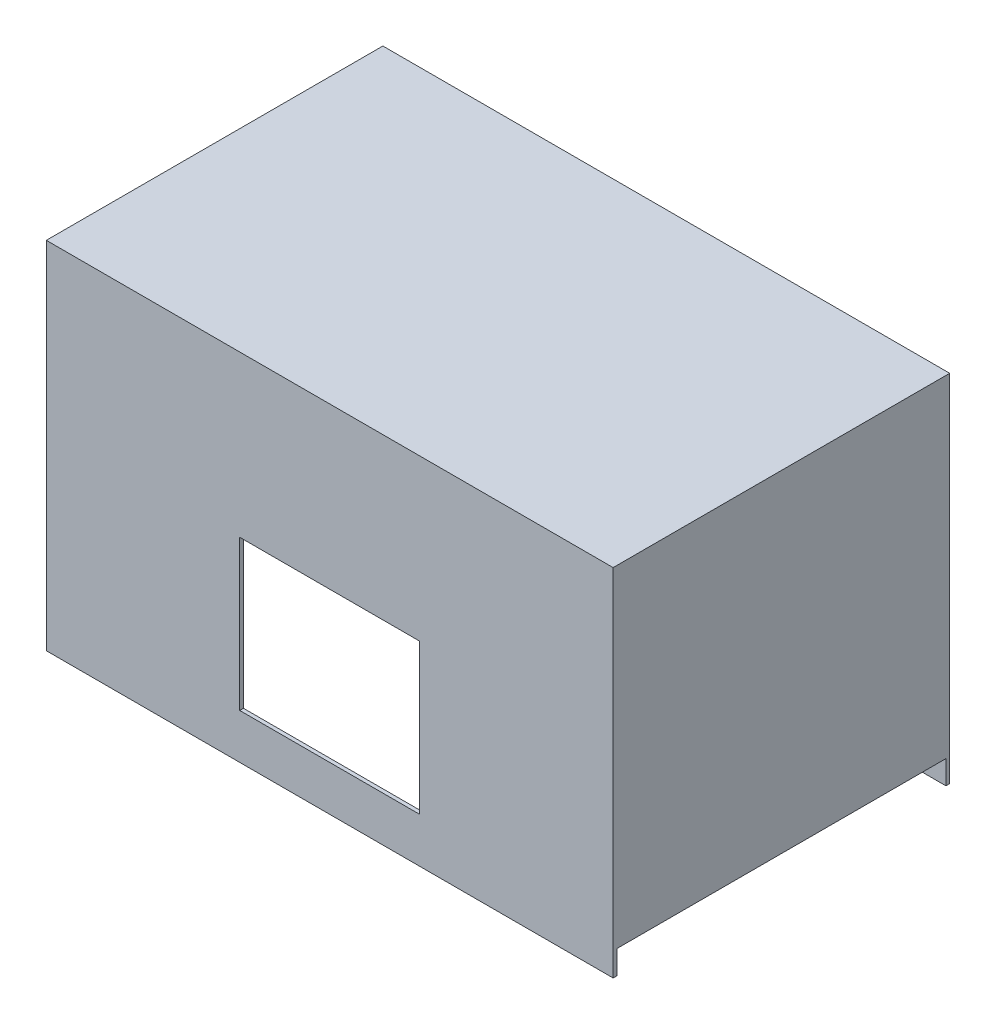
ISO-10303-21;
HEADER;
FILE_DESCRIPTION(('STEP AP214'),'2;1');
FILE_NAME('part.step','',(''),(''),'','','');
FILE_SCHEMA(('AUTOMOTIVE_DESIGN { 1 0 10303 214 1 1 1 1 }'));
ENDSEC;
DATA;
#1=APPLICATION_CONTEXT('core data for automotive mechanical design processes');
#2=APPLICATION_PROTOCOL_DEFINITION('international standard','automotive_design',2000,#1);
#3=PRODUCT_CONTEXT('',#1,'mechanical');
#4=PRODUCT('Part','Part','',(#3));
#5=PRODUCT_RELATED_PRODUCT_CATEGORY('part','',(#4));
#6=PRODUCT_DEFINITION_FORMATION('','',#4);
#7=PRODUCT_DEFINITION_CONTEXT('part definition',#1,'design');
#8=PRODUCT_DEFINITION('design','',#6,#7);
#9=PRODUCT_DEFINITION_SHAPE('','',#8);
#10=(LENGTH_UNIT() NAMED_UNIT(*) SI_UNIT(.MILLI.,.METRE.));
#11=(NAMED_UNIT(*) PLANE_ANGLE_UNIT() SI_UNIT($,.RADIAN.));
#12=(NAMED_UNIT(*) SI_UNIT($,.STERADIAN.) SOLID_ANGLE_UNIT());
#13=UNCERTAINTY_MEASURE_WITH_UNIT(LENGTH_MEASURE(1.E-05),#10,'distance_accuracy_value','');
#14=(GEOMETRIC_REPRESENTATION_CONTEXT(3) GLOBAL_UNCERTAINTY_ASSIGNED_CONTEXT((#13)) GLOBAL_UNIT_ASSIGNED_CONTEXT((#10,
#11,#12)) REPRESENTATION_CONTEXT('',''));
#15=CARTESIAN_POINT('',(0.,0.,0.));
#16=DIRECTION('',(0.,0.,1.));
#17=DIRECTION('',(1.,0.,0.));
#18=AXIS2_PLACEMENT_3D('',#15,#16,#17);
#19=CARTESIAN_POINT('',(-480.,-300.99,285.));
#20=DIRECTION('',(0.,1.,0.));
#21=DIRECTION('',(0.,0.,1.));
#22=AXIS2_PLACEMENT_3D('',#19,#20,#21);
#23=PLANE('',#22);
#24=DIRECTION('',(0.,0.,-1.));
#25=VECTOR('',#24,1.);
#26=CARTESIAN_POINT('',(-480.,-300.99,285.));
#27=LINE('',#26,#25);
#28=CARTESIAN_POINT('',(-480.,-300.99,285.));
#29=VERTEX_POINT('',#28);
#30=CARTESIAN_POINT('',(-480.,-300.99,278.65));
#31=VERTEX_POINT('',#30);
#32=EDGE_CURVE('E308',#29,#31,#27,.T.);
#33=ORIENTED_EDGE('',*,*,#32,.T.);
#34=DIRECTION('',(-1.,0.,0.));
#35=VECTOR('',#34,1.);
#36=CARTESIAN_POINT('',(-473.65,-300.99,278.65));
#37=LINE('',#36,#35);
#38=CARTESIAN_POINT('',(480.,-300.99,278.65));
#39=VERTEX_POINT('',#38);
#40=EDGE_CURVE('E235',#39,#31,#37,.T.);
#41=ORIENTED_EDGE('',*,*,#40,.F.);
#42=DIRECTION('',(0.,0.,-1.));
#43=VECTOR('',#42,1.);
#44=CARTESIAN_POINT('',(480.,-300.99,285.));
#45=LINE('',#44,#43);
#46=CARTESIAN_POINT('',(480.,-300.99,285.));
#47=VERTEX_POINT('',#46);
#48=EDGE_CURVE('E303',#47,#39,#45,.T.);
#49=ORIENTED_EDGE('',*,*,#48,.F.);
#50=DIRECTION('',(1.,0.,0.));
#51=VECTOR('',#50,1.);
#52=CARTESIAN_POINT('',(-480.,-300.99,285.));
#53=LINE('',#52,#51);
#54=EDGE_CURVE('E272',#29,#47,#53,.T.);
#55=ORIENTED_EDGE('',*,*,#54,.F.);
#56=EDGE_LOOP('',(#33,#41,#49,#55));
#57=FACE_BOUND('',#56,.T.);
#58=ADVANCED_FACE('F39',(#57),#23,.F.);
#59=CARTESIAN_POINT('',(-480.,300.99,285.));
#60=DIRECTION('',(1.,0.,0.));
#61=DIRECTION('',(0.,1.,0.));
#62=AXIS2_PLACEMENT_3D('',#59,#60,#61);
#63=PLANE('',#62);
#64=DIRECTION('',(0.,0.,1.));
#65=VECTOR('',#64,1.);
#66=CARTESIAN_POINT('',(-480.,-260.99,278.65));
#67=LINE('',#66,#65);
#68=CARTESIAN_POINT('',(-480.,-260.99,-278.65));
#69=VERTEX_POINT('',#68);
#70=CARTESIAN_POINT('',(-480.,-260.99,278.65));
#71=VERTEX_POINT('',#70);
#72=EDGE_CURVE('E198',#69,#71,#67,.T.);
#73=ORIENTED_EDGE('',*,*,#72,.T.);
#74=DIRECTION('',(0.,-1.,0.));
#75=VECTOR('',#74,1.);
#76=CARTESIAN_POINT('',(-480.,-300.99,278.65));
#77=LINE('',#76,#75);
#78=EDGE_CURVE('E189',#71,#31,#77,.T.);
#79=ORIENTED_EDGE('',*,*,#78,.T.);
#80=ORIENTED_EDGE('',*,*,#32,.F.);
#81=DIRECTION('',(0.,-1.,0.));
#82=VECTOR('',#81,1.);
#83=CARTESIAN_POINT('',(-480.,300.99,285.));
#84=LINE('',#83,#82);
#85=CARTESIAN_POINT('',(-480.,300.99,285.));
#86=VERTEX_POINT('',#85);
#87=EDGE_CURVE('E268',#86,#29,#84,.T.);
#88=ORIENTED_EDGE('',*,*,#87,.F.);
#89=DIRECTION('',(0.,0.,-1.));
#90=VECTOR('',#89,1.);
#91=CARTESIAN_POINT('',(-480.,300.99,285.));
#92=LINE('',#91,#90);
#93=CARTESIAN_POINT('',(-480.,300.99,-285.));
#94=VERTEX_POINT('',#93);
#95=EDGE_CURVE('E282',#86,#94,#92,.T.);
#96=ORIENTED_EDGE('',*,*,#95,.T.);
#97=DIRECTION('',(0.,-1.,0.));
#98=VECTOR('',#97,1.);
#99=CARTESIAN_POINT('',(-480.,300.99,-285.));
#100=LINE('',#99,#98);
#101=CARTESIAN_POINT('',(-480.,-300.99,-285.));
#102=VERTEX_POINT('',#101);
#103=EDGE_CURVE('E256',#94,#102,#100,.T.);
#104=ORIENTED_EDGE('',*,*,#103,.T.);
#105=CARTESIAN_POINT('',(-480.,-300.99,-278.65));
#106=VERTEX_POINT('',#105);
#107=EDGE_CURVE('E307',#106,#102,#27,.T.);
#108=ORIENTED_EDGE('',*,*,#107,.F.);
#109=DIRECTION('',(0.,1.,0.));
#110=VECTOR('',#109,1.);
#111=CARTESIAN_POINT('',(-480.,-300.99,-278.65));
#112=LINE('',#111,#110);
#113=EDGE_CURVE('E193',#106,#69,#112,.T.);
#114=ORIENTED_EDGE('',*,*,#113,.T.);
#115=EDGE_LOOP('',(#73,#79,#80,#88,#96,#104,#108,#114));
#116=FACE_BOUND('',#115,.T.);
#117=ADVANCED_FACE('F41',(#116),#63,.F.);
#118=CARTESIAN_POINT('',(480.,-300.99,-278.65));
#119=VERTEX_POINT('',#118);
#120=CARTESIAN_POINT('',(480.,-300.99,-285.));
#121=VERTEX_POINT('',#120);
#122=EDGE_CURVE('E302',#119,#121,#45,.T.);
#123=ORIENTED_EDGE('',*,*,#122,.F.);
#124=DIRECTION('',(1.,0.,0.));
#125=VECTOR('',#124,1.);
#126=CARTESIAN_POINT('',(-473.65,-300.99,-278.65));
#127=LINE('',#126,#125);
#128=EDGE_CURVE('E229',#106,#119,#127,.T.);
#129=ORIENTED_EDGE('',*,*,#128,.F.);
#130=ORIENTED_EDGE('',*,*,#107,.T.);
#131=DIRECTION('',(1.,0.,0.));
#132=VECTOR('',#131,1.);
#133=CARTESIAN_POINT('',(-480.,-300.99,-285.));
#134=LINE('',#133,#132);
#135=EDGE_CURVE('E286',#102,#121,#134,.T.);
#136=ORIENTED_EDGE('',*,*,#135,.T.);
#137=EDGE_LOOP('',(#123,#129,#130,#136));
#138=FACE_BOUND('',#137,.T.);
#139=ADVANCED_FACE('F339',(#138),#23,.F.);
#140=CARTESIAN_POINT('',(480.,300.99,285.));
#141=DIRECTION('',(-1.,0.,0.));
#142=DIRECTION('',(0.,-1.,0.));
#143=AXIS2_PLACEMENT_3D('',#140,#141,#142);
#144=PLANE('',#143);
#145=ORIENTED_EDGE('',*,*,#48,.T.);
#146=DIRECTION('',(0.,-1.,0.));
#147=VECTOR('',#146,1.);
#148=CARTESIAN_POINT('',(480.,-300.99,278.65));
#149=LINE('',#148,#147);
#150=CARTESIAN_POINT('',(480.,-260.99,278.65));
#151=VERTEX_POINT('',#150);
#152=EDGE_CURVE('E184',#151,#39,#149,.T.);
#153=ORIENTED_EDGE('',*,*,#152,.F.);
#154=DIRECTION('',(0.,0.,1.));
#155=VECTOR('',#154,1.);
#156=CARTESIAN_POINT('',(480.,-260.99,278.65));
#157=LINE('',#156,#155);
#158=CARTESIAN_POINT('',(480.,-260.99,-278.65));
#159=VERTEX_POINT('',#158);
#160=EDGE_CURVE('E194',#159,#151,#157,.T.);
#161=ORIENTED_EDGE('',*,*,#160,.F.);
#162=DIRECTION('',(0.,1.,0.));
#163=VECTOR('',#162,1.);
#164=CARTESIAN_POINT('',(480.,-300.99,-278.65));
#165=LINE('',#164,#163);
#166=EDGE_CURVE('E206',#119,#159,#165,.T.);
#167=ORIENTED_EDGE('',*,*,#166,.F.);
#168=ORIENTED_EDGE('',*,*,#122,.T.);
#169=DIRECTION('',(0.,1.,0.));
#170=VECTOR('',#169,1.);
#171=CARTESIAN_POINT('',(480.,300.99,-285.));
#172=LINE('',#171,#170);
#173=CARTESIAN_POINT('',(480.,300.99,-285.));
#174=VERTEX_POINT('',#173);
#175=EDGE_CURVE('E290',#121,#174,#172,.T.);
#176=ORIENTED_EDGE('',*,*,#175,.T.);
#177=DIRECTION('',(0.,0.,-1.));
#178=VECTOR('',#177,1.);
#179=CARTESIAN_POINT('',(480.,300.99,285.));
#180=LINE('',#179,#178);
#181=CARTESIAN_POINT('',(480.,300.99,285.));
#182=VERTEX_POINT('',#181);
#183=EDGE_CURVE('E298',#182,#174,#180,.T.);
#184=ORIENTED_EDGE('',*,*,#183,.F.);
#185=DIRECTION('',(0.,1.,0.));
#186=VECTOR('',#185,1.);
#187=CARTESIAN_POINT('',(480.,300.99,285.));
#188=LINE('',#187,#186);
#189=EDGE_CURVE('E276',#47,#182,#188,.T.);
#190=ORIENTED_EDGE('',*,*,#189,.F.);
#191=EDGE_LOOP('',(#145,#153,#161,#167,#168,#176,#184,#190));
#192=FACE_BOUND('',#191,.T.);
#193=ADVANCED_FACE('F346',(#192),#144,.F.);
#194=CARTESIAN_POINT('',(-480.,300.99,285.));
#195=DIRECTION('',(0.,-1.,0.));
#196=DIRECTION('',(1.,0.,0.));
#197=AXIS2_PLACEMENT_3D('',#194,#195,#196);
#198=PLANE('',#197);
#199=DIRECTION('',(-1.,0.,0.));
#200=VECTOR('',#199,1.);
#201=CARTESIAN_POINT('',(-480.,300.99,-285.));
#202=LINE('',#201,#200);
#203=EDGE_CURVE('E273',#174,#94,#202,.T.);
#204=ORIENTED_EDGE('',*,*,#203,.T.);
#205=ORIENTED_EDGE('',*,*,#95,.F.);
#206=DIRECTION('',(-1.,0.,0.));
#207=VECTOR('',#206,1.);
#208=CARTESIAN_POINT('',(-480.,300.99,285.));
#209=LINE('',#208,#207);
#210=EDGE_CURVE('E279',#182,#86,#209,.T.);
#211=ORIENTED_EDGE('',*,*,#210,.F.);
#212=ORIENTED_EDGE('',*,*,#183,.T.);
#213=EDGE_LOOP('',(#204,#205,#211,#212));
#214=FACE_BOUND('',#213,.T.);
#215=ADVANCED_FACE('F351',(#214),#198,.F.);
#216=CARTESIAN_POINT('',(0.,0.,285.));
#217=DIRECTION('',(0.,0.,1.));
#218=DIRECTION('',(1.,0.,0.));
#219=AXIS2_PLACEMENT_3D('',#216,#217,#218);
#220=PLANE('',#219);
#221=DIRECTION('',(0.,-1.,0.));
#222=VECTOR('',#221,1.);
#223=CARTESIAN_POINT('',(-152.4,29.21,285.));
#224=LINE('',#223,#222);
#225=CARTESIAN_POINT('',(-152.4,29.21,285.));
#226=VERTEX_POINT('',#225);
#227=CARTESIAN_POINT('',(-152.4,-224.79,285.));
#228=VERTEX_POINT('',#227);
#229=EDGE_CURVE('E55',#226,#228,#224,.T.);
#230=ORIENTED_EDGE('',*,*,#229,.F.);
#231=DIRECTION('',(-1.,0.,0.));
#232=VECTOR('',#231,1.);
#233=CARTESIAN_POINT('',(-152.4,29.21,285.));
#234=LINE('',#233,#232);
#235=CARTESIAN_POINT('',(152.4,29.21,285.));
#236=VERTEX_POINT('',#235);
#237=EDGE_CURVE('E174',#236,#226,#234,.T.);
#238=ORIENTED_EDGE('',*,*,#237,.F.);
#239=DIRECTION('',(0.,1.,0.));
#240=VECTOR('',#239,1.);
#241=CARTESIAN_POINT('',(152.4,29.21,285.));
#242=LINE('',#241,#240);
#243=CARTESIAN_POINT('',(152.4,-224.79,285.));
#244=VERTEX_POINT('',#243);
#245=EDGE_CURVE('E156',#244,#236,#242,.T.);
#246=ORIENTED_EDGE('',*,*,#245,.F.);
#247=DIRECTION('',(1.,0.,0.));
#248=VECTOR('',#247,1.);
#249=CARTESIAN_POINT('',(-152.4,-224.79,285.));
#250=LINE('',#249,#248);
#251=EDGE_CURVE('E166',#228,#244,#250,.T.);
#252=ORIENTED_EDGE('',*,*,#251,.F.);
#253=EDGE_LOOP('',(#230,#238,#246,#252));
#254=FACE_BOUND('',#253,.T.);
#255=ORIENTED_EDGE('',*,*,#87,.T.);
#256=ORIENTED_EDGE('',*,*,#54,.T.);
#257=ORIENTED_EDGE('',*,*,#189,.T.);
#258=ORIENTED_EDGE('',*,*,#210,.T.);
#259=EDGE_LOOP('',(#255,#256,#257,#258));
#260=FACE_BOUND('',#259,.T.);
#261=ADVANCED_FACE('F171',(#254,#260),#220,.T.);
#262=CARTESIAN_POINT('',(0.,0.,-285.));
#263=DIRECTION('',(0.,0.,1.));
#264=DIRECTION('',(1.,0.,0.));
#265=AXIS2_PLACEMENT_3D('',#262,#263,#264);
#266=PLANE('',#265);
#267=ORIENTED_EDGE('',*,*,#103,.F.);
#268=ORIENTED_EDGE('',*,*,#203,.F.);
#269=ORIENTED_EDGE('',*,*,#175,.F.);
#270=ORIENTED_EDGE('',*,*,#135,.F.);
#271=EDGE_LOOP('',(#267,#268,#269,#270));
#272=FACE_BOUND('',#271,.T.);
#273=ADVANCED_FACE('F386',(#272),#266,.F.);
#274=CARTESIAN_POINT('',(-473.65,294.64,278.65));
#275=DIRECTION('',(-1.,0.,0.));
#276=DIRECTION('',(0.,0.,1.));
#277=AXIS2_PLACEMENT_3D('',#274,#275,#276);
#278=PLANE('',#277);
#279=DIRECTION('',(0.,-1.,0.));
#280=VECTOR('',#279,1.);
#281=CARTESIAN_POINT('',(-473.65,294.64,278.65));
#282=LINE('',#281,#280);
#283=CARTESIAN_POINT('',(-473.65,294.64,278.65));
#284=VERTEX_POINT('',#283);
#285=CARTESIAN_POINT('',(-473.65,-260.99,278.65));
#286=VERTEX_POINT('',#285);
#287=EDGE_CURVE('E252',#284,#286,#282,.T.);
#288=ORIENTED_EDGE('',*,*,#287,.T.);
#289=DIRECTION('',(0.,0.,-1.));
#290=VECTOR('',#289,1.);
#291=CARTESIAN_POINT('',(-473.65,-260.99,278.65));
#292=LINE('',#291,#290);
#293=CARTESIAN_POINT('',(-473.65,-260.99,-278.65));
#294=VERTEX_POINT('',#293);
#295=EDGE_CURVE('E225',#286,#294,#292,.T.);
#296=ORIENTED_EDGE('',*,*,#295,.T.);
#297=DIRECTION('',(0.,-1.,0.));
#298=VECTOR('',#297,1.);
#299=CARTESIAN_POINT('',(-473.65,294.64,-278.65));
#300=LINE('',#299,#298);
#301=CARTESIAN_POINT('',(-473.65,294.64,-278.65));
#302=VERTEX_POINT('',#301);
#303=EDGE_CURVE('E247',#302,#294,#300,.T.);
#304=ORIENTED_EDGE('',*,*,#303,.F.);
#305=DIRECTION('',(0.,0.,-1.));
#306=VECTOR('',#305,1.);
#307=CARTESIAN_POINT('',(-473.65,294.64,278.65));
#308=LINE('',#307,#306);
#309=EDGE_CURVE('E230',#284,#302,#308,.T.);
#310=ORIENTED_EDGE('',*,*,#309,.F.);
#311=EDGE_LOOP('',(#288,#296,#304,#310));
#312=FACE_BOUND('',#311,.T.);
#313=ADVANCED_FACE('F380',(#312),#278,.F.);
#314=CARTESIAN_POINT('',(-473.65,294.64,278.65));
#315=DIRECTION('',(0.,0.,1.));
#316=DIRECTION('',(1.,0.,0.));
#317=AXIS2_PLACEMENT_3D('',#314,#315,#316);
#318=PLANE('',#317);
#319=DIRECTION('',(-1.,0.,0.));
#320=VECTOR('',#319,1.);
#321=CARTESIAN_POINT('',(-473.65,29.21,278.65));
#322=LINE('',#321,#320);
#323=CARTESIAN_POINT('',(152.4,29.21,278.65));
#324=VERTEX_POINT('',#323);
#325=CARTESIAN_POINT('',(-152.4,29.21,278.65));
#326=VERTEX_POINT('',#325);
#327=EDGE_CURVE('E48',#324,#326,#322,.T.);
#328=ORIENTED_EDGE('',*,*,#327,.T.);
#329=DIRECTION('',(0.,-1.,0.));
#330=VECTOR('',#329,1.);
#331=CARTESIAN_POINT('',(-152.4,294.64,278.65));
#332=LINE('',#331,#330);
#333=CARTESIAN_POINT('',(-152.4,-224.79,278.65));
#334=VERTEX_POINT('',#333);
#335=EDGE_CURVE('E11',#326,#334,#332,.T.);
#336=ORIENTED_EDGE('',*,*,#335,.T.);
#337=DIRECTION('',(1.,0.,0.));
#338=VECTOR('',#337,1.);
#339=CARTESIAN_POINT('',(-473.65,-224.79,278.65));
#340=LINE('',#339,#338);
#341=CARTESIAN_POINT('',(152.4,-224.79,278.65));
#342=VERTEX_POINT('',#341);
#343=EDGE_CURVE('E312',#334,#342,#340,.T.);
#344=ORIENTED_EDGE('',*,*,#343,.T.);
#345=DIRECTION('',(0.,1.,0.));
#346=VECTOR('',#345,1.);
#347=CARTESIAN_POINT('',(152.4,294.64,278.65));
#348=LINE('',#347,#346);
#349=EDGE_CURVE('E159',#342,#324,#348,.T.);
#350=ORIENTED_EDGE('',*,*,#349,.T.);
#351=EDGE_LOOP('',(#328,#336,#344,#350));
#352=FACE_BOUND('',#351,.T.);
#353=DIRECTION('',(0.,-1.,0.));
#354=VECTOR('',#353,1.);
#355=CARTESIAN_POINT('',(473.65,294.64,278.65));
#356=LINE('',#355,#354);
#357=CARTESIAN_POINT('',(473.65,294.64,278.65));
#358=VERTEX_POINT('',#357);
#359=CARTESIAN_POINT('',(473.65,-260.99,278.65));
#360=VERTEX_POINT('',#359);
#361=EDGE_CURVE('E257',#358,#360,#356,.T.);
#362=ORIENTED_EDGE('',*,*,#361,.T.);
#363=DIRECTION('',(1.,0.,0.));
#364=VECTOR('',#363,1.);
#365=CARTESIAN_POINT('',(-480.,-260.99,278.65));
#366=LINE('',#365,#364);
#367=EDGE_CURVE('E218',#360,#151,#366,.T.);
#368=ORIENTED_EDGE('',*,*,#367,.T.);
#369=ORIENTED_EDGE('',*,*,#152,.T.);
#370=ORIENTED_EDGE('',*,*,#40,.T.);
#371=ORIENTED_EDGE('',*,*,#78,.F.);
#372=EDGE_CURVE('E213',#71,#286,#366,.T.);
#373=ORIENTED_EDGE('',*,*,#372,.T.);
#374=ORIENTED_EDGE('',*,*,#287,.F.);
#375=DIRECTION('',(-1.,0.,0.));
#376=VECTOR('',#375,1.);
#377=CARTESIAN_POINT('',(-473.65,294.64,278.65));
#378=LINE('',#377,#376);
#379=EDGE_CURVE('E243',#358,#284,#378,.T.);
#380=ORIENTED_EDGE('',*,*,#379,.F.);
#381=EDGE_LOOP('',(#362,#368,#369,#370,#371,#373,#374,#380));
#382=FACE_BOUND('',#381,.T.);
#383=ADVANCED_FACE('F319',(#352,#382),#318,.F.);
#384=CARTESIAN_POINT('',(473.65,294.64,278.65));
#385=DIRECTION('',(1.,0.,0.));
#386=DIRECTION('',(0.,0.,-1.));
#387=AXIS2_PLACEMENT_3D('',#384,#385,#386);
#388=PLANE('',#387);
#389=DIRECTION('',(0.,-1.,0.));
#390=VECTOR('',#389,1.);
#391=CARTESIAN_POINT('',(473.65,294.64,-278.65));
#392=LINE('',#391,#390);
#393=CARTESIAN_POINT('',(473.65,294.64,-278.65));
#394=VERTEX_POINT('',#393);
#395=CARTESIAN_POINT('',(473.65,-260.99,-278.65));
#396=VERTEX_POINT('',#395);
#397=EDGE_CURVE('E261',#394,#396,#392,.T.);
#398=ORIENTED_EDGE('',*,*,#397,.T.);
#399=DIRECTION('',(0.,0.,1.));
#400=VECTOR('',#399,1.);
#401=CARTESIAN_POINT('',(473.65,-260.99,278.65));
#402=LINE('',#401,#400);
#403=EDGE_CURVE('E217',#396,#360,#402,.T.);
#404=ORIENTED_EDGE('',*,*,#403,.T.);
#405=ORIENTED_EDGE('',*,*,#361,.F.);
#406=DIRECTION('',(0.,0.,1.));
#407=VECTOR('',#406,1.);
#408=CARTESIAN_POINT('',(473.65,294.64,278.65));
#409=LINE('',#408,#407);
#410=EDGE_CURVE('E239',#394,#358,#409,.T.);
#411=ORIENTED_EDGE('',*,*,#410,.F.);
#412=EDGE_LOOP('',(#398,#404,#405,#411));
#413=FACE_BOUND('',#412,.T.);
#414=ADVANCED_FACE('F373',(#413),#388,.F.);
#415=CARTESIAN_POINT('',(-473.65,294.64,-278.65));
#416=DIRECTION('',(0.,0.,-1.));
#417=DIRECTION('',(-1.,0.,0.));
#418=AXIS2_PLACEMENT_3D('',#415,#416,#417);
#419=PLANE('',#418);
#420=ORIENTED_EDGE('',*,*,#303,.T.);
#421=DIRECTION('',(1.,0.,0.));
#422=VECTOR('',#421,1.);
#423=CARTESIAN_POINT('',(-480.,-260.99,-278.65));
#424=LINE('',#423,#422);
#425=EDGE_CURVE('E219',#69,#294,#424,.T.);
#426=ORIENTED_EDGE('',*,*,#425,.F.);
#427=ORIENTED_EDGE('',*,*,#113,.F.);
#428=ORIENTED_EDGE('',*,*,#128,.T.);
#429=ORIENTED_EDGE('',*,*,#166,.T.);
#430=EDGE_CURVE('E202',#396,#159,#424,.T.);
#431=ORIENTED_EDGE('',*,*,#430,.F.);
#432=ORIENTED_EDGE('',*,*,#397,.F.);
#433=DIRECTION('',(1.,0.,0.));
#434=VECTOR('',#433,1.);
#435=CARTESIAN_POINT('',(-473.65,294.64,-278.65));
#436=LINE('',#435,#434);
#437=EDGE_CURVE('E234',#302,#394,#436,.T.);
#438=ORIENTED_EDGE('',*,*,#437,.F.);
#439=EDGE_LOOP('',(#420,#426,#427,#428,#429,#431,#432,#438));
#440=FACE_BOUND('',#439,.T.);
#441=ADVANCED_FACE('F367',(#440),#419,.F.);
#442=CARTESIAN_POINT('',(0.,294.64,0.));
#443=DIRECTION('',(0.,-1.,0.));
#444=DIRECTION('',(0.,0.,-1.));
#445=AXIS2_PLACEMENT_3D('',#442,#443,#444);
#446=PLANE('',#445);
#447=ORIENTED_EDGE('',*,*,#309,.T.);
#448=ORIENTED_EDGE('',*,*,#437,.T.);
#449=ORIENTED_EDGE('',*,*,#410,.T.);
#450=ORIENTED_EDGE('',*,*,#379,.T.);
#451=EDGE_LOOP('',(#447,#448,#449,#450));
#452=FACE_BOUND('',#451,.T.);
#453=ADVANCED_FACE('F378',(#452),#446,.T.);
#454=CARTESIAN_POINT('',(-480.,-260.99,278.65));
#455=DIRECTION('',(0.,1.,0.));
#456=DIRECTION('',(-1.,0.,0.));
#457=AXIS2_PLACEMENT_3D('',#454,#455,#456);
#458=PLANE('',#457);
#459=ORIENTED_EDGE('',*,*,#430,.T.);
#460=ORIENTED_EDGE('',*,*,#160,.T.);
#461=ORIENTED_EDGE('',*,*,#367,.F.);
#462=ORIENTED_EDGE('',*,*,#403,.F.);
#463=EDGE_LOOP('',(#459,#460,#461,#462));
#464=FACE_BOUND('',#463,.T.);
#465=ADVANCED_FACE('F333',(#464),#458,.F.);
#466=ORIENTED_EDGE('',*,*,#372,.F.);
#467=ORIENTED_EDGE('',*,*,#72,.F.);
#468=ORIENTED_EDGE('',*,*,#425,.T.);
#469=ORIENTED_EDGE('',*,*,#295,.F.);
#470=EDGE_LOOP('',(#466,#467,#468,#469));
#471=FACE_BOUND('',#470,.T.);
#472=ADVANCED_FACE('F326',(#471),#458,.F.);
#473=CARTESIAN_POINT('',(-152.4,29.21,259.6));
#474=DIRECTION('',(-1.,0.,0.));
#475=DIRECTION('',(0.,0.,1.));
#476=AXIS2_PLACEMENT_3D('',#473,#474,#475);
#477=PLANE('',#476);
#478=DIRECTION('',(0.,0.,1.));
#479=VECTOR('',#478,1.);
#480=CARTESIAN_POINT('',(-152.4,29.21,259.6));
#481=LINE('',#480,#479);
#482=EDGE_CURVE('E181',#326,#226,#481,.T.);
#483=ORIENTED_EDGE('',*,*,#482,.T.);
#484=ORIENTED_EDGE('',*,*,#229,.T.);
#485=DIRECTION('',(0.,0.,1.));
#486=VECTOR('',#485,1.);
#487=CARTESIAN_POINT('',(-152.4,-224.79,259.6));
#488=LINE('',#487,#486);
#489=EDGE_CURVE('E163',#334,#228,#488,.T.);
#490=ORIENTED_EDGE('',*,*,#489,.F.);
#491=ORIENTED_EDGE('',*,*,#335,.F.);
#492=EDGE_LOOP('',(#483,#484,#490,#491));
#493=FACE_BOUND('',#492,.T.);
#494=ADVANCED_FACE('F324',(#493),#477,.F.);
#495=CARTESIAN_POINT('',(-152.4,29.21,259.6));
#496=DIRECTION('',(0.,1.,0.));
#497=DIRECTION('',(0.,0.,1.));
#498=AXIS2_PLACEMENT_3D('',#495,#496,#497);
#499=PLANE('',#498);
#500=DIRECTION('',(0.,0.,1.));
#501=VECTOR('',#500,1.);
#502=CARTESIAN_POINT('',(152.4,29.21,259.6));
#503=LINE('',#502,#501);
#504=EDGE_CURVE('E162',#324,#236,#503,.T.);
#505=ORIENTED_EDGE('',*,*,#504,.T.);
#506=ORIENTED_EDGE('',*,*,#237,.T.);
#507=ORIENTED_EDGE('',*,*,#482,.F.);
#508=ORIENTED_EDGE('',*,*,#327,.F.);
#509=EDGE_LOOP('',(#505,#506,#507,#508));
#510=FACE_BOUND('',#509,.T.);
#511=ADVANCED_FACE('F323',(#510),#499,.F.);
#512=CARTESIAN_POINT('',(152.4,29.21,259.6));
#513=DIRECTION('',(1.,0.,0.));
#514=DIRECTION('',(0.,0.,-1.));
#515=AXIS2_PLACEMENT_3D('',#512,#513,#514);
#516=PLANE('',#515);
#517=DIRECTION('',(0.,0.,1.));
#518=VECTOR('',#517,1.);
#519=CARTESIAN_POINT('',(152.4,-224.79,259.6));
#520=LINE('',#519,#518);
#521=EDGE_CURVE('E63',#342,#244,#520,.T.);
#522=ORIENTED_EDGE('',*,*,#521,.T.);
#523=ORIENTED_EDGE('',*,*,#245,.T.);
#524=ORIENTED_EDGE('',*,*,#504,.F.);
#525=ORIENTED_EDGE('',*,*,#349,.F.);
#526=EDGE_LOOP('',(#522,#523,#524,#525));
#527=FACE_BOUND('',#526,.T.);
#528=ADVANCED_FACE('F153',(#527),#516,.F.);
#529=CARTESIAN_POINT('',(-152.4,-224.79,259.6));
#530=DIRECTION('',(0.,-1.,0.));
#531=DIRECTION('',(0.,0.,-1.));
#532=AXIS2_PLACEMENT_3D('',#529,#530,#531);
#533=PLANE('',#532);
#534=ORIENTED_EDGE('',*,*,#489,.T.);
#535=ORIENTED_EDGE('',*,*,#251,.T.);
#536=ORIENTED_EDGE('',*,*,#521,.F.);
#537=ORIENTED_EDGE('',*,*,#343,.F.);
#538=EDGE_LOOP('',(#534,#535,#536,#537));
#539=FACE_BOUND('',#538,.T.);
#540=ADVANCED_FACE('F167',(#539),#533,.F.);
#541=CLOSED_SHELL('',(#58,#117,#139,#193,#215,#261,#273,#313,#383,#414,#441,#453,#465,#472,#494,
#511,#528,#540));
#542=MANIFOLD_SOLID_BREP('B2',#541);
#543=ADVANCED_BREP_SHAPE_REPRESENTATION('',(#18,#542),#14);
#544=SHAPE_DEFINITION_REPRESENTATION(#9,#543);
ENDSEC;
END-ISO-10303-21;
